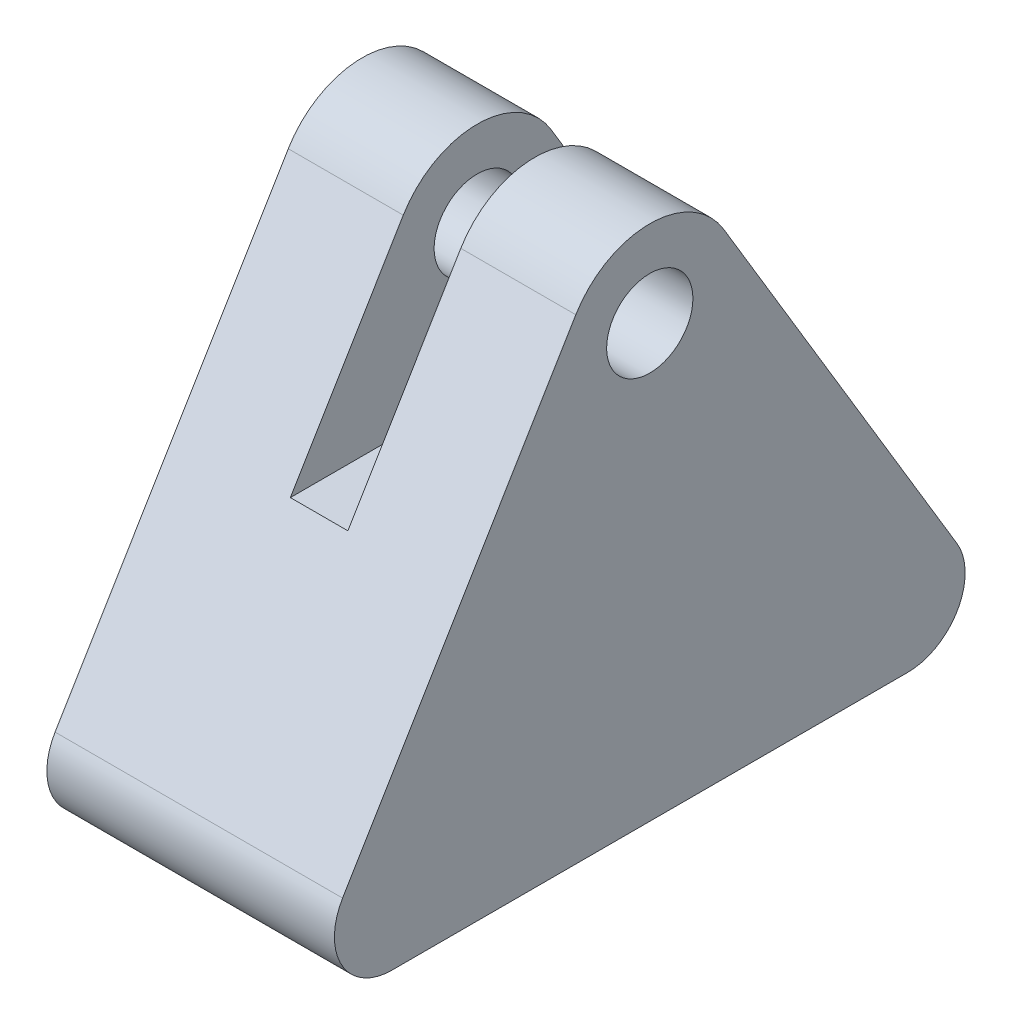
ISO-10303-21;
HEADER;
FILE_DESCRIPTION(('STEP AP214'),'2;1');
FILE_NAME('part.step','',(''),(''),'','','');
FILE_SCHEMA(('AUTOMOTIVE_DESIGN { 1 0 10303 214 1 1 1 1 }'));
ENDSEC;
DATA;
#1=APPLICATION_CONTEXT('core data for automotive mechanical design processes');
#2=APPLICATION_PROTOCOL_DEFINITION('international standard','automotive_design',2000,#1);
#3=PRODUCT_CONTEXT('',#1,'mechanical');
#4=PRODUCT('Part','Part','',(#3));
#5=PRODUCT_RELATED_PRODUCT_CATEGORY('part','',(#4));
#6=PRODUCT_DEFINITION_FORMATION('','',#4);
#7=PRODUCT_DEFINITION_CONTEXT('part definition',#1,'design');
#8=PRODUCT_DEFINITION('design','',#6,#7);
#9=PRODUCT_DEFINITION_SHAPE('','',#8);
#10=(LENGTH_UNIT() NAMED_UNIT(*) SI_UNIT(.MILLI.,.METRE.));
#11=(NAMED_UNIT(*) PLANE_ANGLE_UNIT() SI_UNIT($,.RADIAN.));
#12=(NAMED_UNIT(*) SI_UNIT($,.STERADIAN.) SOLID_ANGLE_UNIT());
#13=UNCERTAINTY_MEASURE_WITH_UNIT(LENGTH_MEASURE(1.E-05),#10,'distance_accuracy_value','');
#14=(GEOMETRIC_REPRESENTATION_CONTEXT(3) GLOBAL_UNCERTAINTY_ASSIGNED_CONTEXT((#13)) GLOBAL_UNIT_ASSIGNED_CONTEXT((#10,
#11,#12)) REPRESENTATION_CONTEXT('',''));
#15=CARTESIAN_POINT('',(0.,0.,0.));
#16=DIRECTION('',(0.,0.,1.));
#17=DIRECTION('',(1.,0.,0.));
#18=AXIS2_PLACEMENT_3D('',#15,#16,#17);
#19=CARTESIAN_POINT('',(5.,0.,0.));
#20=DIRECTION('',(-1.,0.,0.));
#21=DIRECTION('',(0.,0.,1.));
#22=AXIS2_PLACEMENT_3D('',#19,#20,#21);
#23=CYLINDRICAL_SURFACE('',#22,3.);
#24=CARTESIAN_POINT('',(-1.,0.,0.));
#25=DIRECTION('',(-1.,0.,0.));
#26=DIRECTION('',(0.,-1.,0.));
#27=AXIS2_PLACEMENT_3D('',#24,#25,#26);
#28=CIRCLE('',#27,3.);
#29=CARTESIAN_POINT('',(-1.,1.54365062769588,2.57238075323505));
#30=VERTEX_POINT('',#29);
#31=CARTESIAN_POINT('',(-1.,1.54365062769588,-2.57238075323505));
#32=VERTEX_POINT('',#31);
#33=EDGE_CURVE('E148',#30,#32,#28,.T.);
#34=ORIENTED_EDGE('',*,*,#33,.T.);
#35=DIRECTION('',(-1.,0.,0.));
#36=VECTOR('',#35,1.);
#37=CARTESIAN_POINT('',(5.,1.54365062769588,-2.57238075323505));
#38=LINE('',#37,#36);
#39=CARTESIAN_POINT('',(-5.,1.54365062769588,-2.57238075323505));
#40=VERTEX_POINT('',#39);
#41=EDGE_CURVE('E167',#32,#40,#38,.T.);
#42=ORIENTED_EDGE('',*,*,#41,.T.);
#43=CARTESIAN_POINT('',(-5.,0.,0.));
#44=DIRECTION('',(1.,0.,0.));
#45=DIRECTION('',(0.,0.,-1.));
#46=AXIS2_PLACEMENT_3D('',#43,#44,#45);
#47=CIRCLE('',#46,3.);
#48=CARTESIAN_POINT('',(-5.,1.54365062769588,2.57238075323505));
#49=VERTEX_POINT('',#48);
#50=EDGE_CURVE('E154',#40,#49,#47,.T.);
#51=ORIENTED_EDGE('',*,*,#50,.T.);
#52=DIRECTION('',(-1.,0.,0.));
#53=VECTOR('',#52,1.);
#54=CARTESIAN_POINT('',(5.,1.54365062769588,2.57238075323505));
#55=LINE('',#54,#53);
#56=EDGE_CURVE('E178',#30,#49,#55,.T.);
#57=ORIENTED_EDGE('',*,*,#56,.F.);
#58=EDGE_LOOP('',(#34,#42,#51,#57));
#59=FACE_BOUND('',#58,.T.);
#60=ADVANCED_FACE('F34',(#59),#23,.T.);
#61=CARTESIAN_POINT('',(5.,0.,0.));
#62=DIRECTION('',(-1.,0.,0.));
#63=DIRECTION('',(0.,0.,1.));
#64=AXIS2_PLACEMENT_3D('',#61,#62,#63);
#65=CYLINDRICAL_SURFACE('',#64,1.5);
#66=CARTESIAN_POINT('',(-1.,0.,0.));
#67=DIRECTION('',(-1.,0.,0.));
#68=DIRECTION('',(0.,-1.,0.));
#69=AXIS2_PLACEMENT_3D('',#66,#67,#68);
#70=CIRCLE('',#69,1.5);
#71=CARTESIAN_POINT('',(-1.,-1.5,0.));
#72=VERTEX_POINT('',#71);
#73=EDGE_CURVE('E137',#72,#72,#70,.T.);
#74=ORIENTED_EDGE('',*,*,#73,.F.);
#75=EDGE_LOOP('',(#74));
#76=FACE_BOUND('',#75,.T.);
#77=CARTESIAN_POINT('',(-5.,0.,0.));
#78=DIRECTION('',(1.,0.,0.));
#79=DIRECTION('',(0.,0.,-1.));
#80=AXIS2_PLACEMENT_3D('',#77,#78,#79);
#81=CIRCLE('',#80,1.5);
#82=CARTESIAN_POINT('',(-5.,0.,-1.5));
#83=VERTEX_POINT('',#82);
#84=EDGE_CURVE('E121',#83,#83,#81,.T.);
#85=ORIENTED_EDGE('',*,*,#84,.F.);
#86=EDGE_LOOP('',(#85));
#87=FACE_BOUND('',#86,.T.);
#88=ADVANCED_FACE('F238',(#76,#87),#65,.F.);
#89=CARTESIAN_POINT('',(5.,0.,0.));
#90=DIRECTION('',(1.,0.,0.));
#91=DIRECTION('',(0.,0.,-1.));
#92=AXIS2_PLACEMENT_3D('',#89,#90,#91);
#93=PLANE('',#92);
#94=DIRECTION('',(0.,0.,-1.));
#95=VECTOR('',#94,1.);
#96=CARTESIAN_POINT('',(5.,-15.,-12.5));
#97=LINE('',#96,#95);
#98=CARTESIAN_POINT('',(5.,-15.,8.96735762426948));
#99=VERTEX_POINT('',#98);
#100=CARTESIAN_POINT('',(5.,-15.,-8.96735762426948));
#101=VERTEX_POINT('',#100);
#102=EDGE_CURVE('E163',#99,#101,#97,.T.);
#103=ORIENTED_EDGE('',*,*,#102,.T.);
#104=CARTESIAN_POINT('',(5.,-13.,-8.96735762426948));
#105=DIRECTION('',(1.,0.,0.));
#106=DIRECTION('',(0.,0.,-1.));
#107=AXIS2_PLACEMENT_3D('',#104,#105,#106);
#108=CIRCLE('',#107,2.);
#109=CARTESIAN_POINT('',(5.,-11.9708995815361,-10.6822781264262));
#110=VERTEX_POINT('',#109);
#111=EDGE_CURVE('E42',#101,#110,#108,.T.);
#112=ORIENTED_EDGE('',*,*,#111,.T.);
#113=DIRECTION('',(0.,0.85746025107835,0.514550209231959));
#114=VECTOR('',#113,1.);
#115=CARTESIAN_POINT('',(5.,1.54365062769588,-2.57238075323505));
#116=LINE('',#115,#114);
#117=CARTESIAN_POINT('',(5.,1.54365062769588,-2.57238075323505));
#118=VERTEX_POINT('',#117);
#119=EDGE_CURVE('E165',#110,#118,#116,.T.);
#120=ORIENTED_EDGE('',*,*,#119,.T.);
#121=CARTESIAN_POINT('',(5.,0.,0.));
#122=DIRECTION('',(1.,0.,0.));
#123=DIRECTION('',(0.,0.,-1.));
#124=AXIS2_PLACEMENT_3D('',#121,#122,#123);
#125=CIRCLE('',#124,3.);
#126=CARTESIAN_POINT('',(5.,1.54365062769588,2.57238075323505));
#127=VERTEX_POINT('',#126);
#128=EDGE_CURVE('E157',#118,#127,#125,.T.);
#129=ORIENTED_EDGE('',*,*,#128,.T.);
#130=DIRECTION('',(0.,-0.85746025107835,0.514550209231959));
#131=VECTOR('',#130,1.);
#132=CARTESIAN_POINT('',(5.,-15.,12.5));
#133=LINE('',#132,#131);
#134=CARTESIAN_POINT('',(5.,-11.9708995815361,10.6822781264262));
#135=VERTEX_POINT('',#134);
#136=EDGE_CURVE('E160',#127,#135,#133,.T.);
#137=ORIENTED_EDGE('',*,*,#136,.T.);
#138=CARTESIAN_POINT('',(5.,-13.,8.96735762426948));
#139=DIRECTION('',(1.,0.,0.));
#140=DIRECTION('',(0.,0.,-1.));
#141=AXIS2_PLACEMENT_3D('',#138,#139,#140);
#142=CIRCLE('',#141,2.);
#143=EDGE_CURVE('E195',#135,#99,#142,.T.);
#144=ORIENTED_EDGE('',*,*,#143,.T.);
#145=EDGE_LOOP('',(#103,#112,#120,#129,#137,#144));
#146=FACE_BOUND('',#145,.T.);
#147=CARTESIAN_POINT('',(5.,0.,0.));
#148=DIRECTION('',(1.,0.,0.));
#149=DIRECTION('',(0.,0.,-1.));
#150=AXIS2_PLACEMENT_3D('',#147,#148,#149);
#151=CIRCLE('',#150,1.5);
#152=CARTESIAN_POINT('',(5.,0.,-1.5));
#153=VERTEX_POINT('',#152);
#154=EDGE_CURVE('E151',#153,#153,#151,.T.);
#155=ORIENTED_EDGE('',*,*,#154,.F.);
#156=EDGE_LOOP('',(#155));
#157=FACE_BOUND('',#156,.T.);
#158=ADVANCED_FACE('F199',(#146,#157),#93,.T.);
#159=CARTESIAN_POINT('',(-5.,0.,0.));
#160=DIRECTION('',(1.,0.,0.));
#161=DIRECTION('',(0.,0.,-1.));
#162=AXIS2_PLACEMENT_3D('',#159,#160,#161);
#163=PLANE('',#162);
#164=DIRECTION('',(0.,0.85746025107835,0.514550209231959));
#165=VECTOR('',#164,1.);
#166=CARTESIAN_POINT('',(-5.,1.54365062769588,-2.57238075323505));
#167=LINE('',#166,#165);
#168=CARTESIAN_POINT('',(-5.,-11.9708995815361,-10.6822781264262));
#169=VERTEX_POINT('',#168);
#170=EDGE_CURVE('E161',#169,#40,#167,.T.);
#171=ORIENTED_EDGE('',*,*,#170,.F.);
#172=CARTESIAN_POINT('',(-5.,-13.,-8.96735762426948));
#173=DIRECTION('',(1.,0.,0.));
#174=DIRECTION('',(0.,0.,-1.));
#175=AXIS2_PLACEMENT_3D('',#172,#173,#174);
#176=CIRCLE('',#175,2.);
#177=CARTESIAN_POINT('',(-5.,-15.,-8.96735762426948));
#178=VERTEX_POINT('',#177);
#179=EDGE_CURVE('E189',#169,#178,#176,.F.);
#180=ORIENTED_EDGE('',*,*,#179,.T.);
#181=DIRECTION('',(0.,0.,-1.));
#182=VECTOR('',#181,1.);
#183=CARTESIAN_POINT('',(-5.,-15.,-12.5));
#184=LINE('',#183,#182);
#185=CARTESIAN_POINT('',(-5.,-15.,8.96735762426948));
#186=VERTEX_POINT('',#185);
#187=EDGE_CURVE('E172',#186,#178,#184,.T.);
#188=ORIENTED_EDGE('',*,*,#187,.F.);
#189=CARTESIAN_POINT('',(-5.,-13.,8.96735762426948));
#190=DIRECTION('',(1.,0.,0.));
#191=DIRECTION('',(0.,0.,-1.));
#192=AXIS2_PLACEMENT_3D('',#189,#190,#191);
#193=CIRCLE('',#192,2.);
#194=CARTESIAN_POINT('',(-5.,-11.9708995815361,10.6822781264262));
#195=VERTEX_POINT('',#194);
#196=EDGE_CURVE('E187',#186,#195,#193,.F.);
#197=ORIENTED_EDGE('',*,*,#196,.T.);
#198=DIRECTION('',(0.,-0.85746025107835,0.514550209231959));
#199=VECTOR('',#198,1.);
#200=CARTESIAN_POINT('',(-5.,-15.,12.5));
#201=LINE('',#200,#199);
#202=EDGE_CURVE('E170',#49,#195,#201,.T.);
#203=ORIENTED_EDGE('',*,*,#202,.F.);
#204=ORIENTED_EDGE('',*,*,#50,.F.);
#205=EDGE_LOOP('',(#171,#180,#188,#197,#203,#204));
#206=FACE_BOUND('',#205,.T.);
#207=ORIENTED_EDGE('',*,*,#84,.T.);
#208=EDGE_LOOP('',(#207));
#209=FACE_BOUND('',#208,.T.);
#210=ADVANCED_FACE('F211',(#206,#209),#163,.F.);
#211=CARTESIAN_POINT('',(1.,1.54365062769588,-2.57238075323505));
#212=VERTEX_POINT('',#211);
#213=EDGE_CURVE('E175',#118,#212,#38,.T.);
#214=ORIENTED_EDGE('',*,*,#213,.T.);
#215=CARTESIAN_POINT('',(1.,0.,0.));
#216=DIRECTION('',(1.,0.,0.));
#217=DIRECTION('',(0.,1.,0.));
#218=AXIS2_PLACEMENT_3D('',#215,#216,#217);
#219=CIRCLE('',#218,3.);
#220=CARTESIAN_POINT('',(1.,1.54365062769588,2.57238075323505));
#221=VERTEX_POINT('',#220);
#222=EDGE_CURVE('E138',#212,#221,#219,.T.);
#223=ORIENTED_EDGE('',*,*,#222,.T.);
#224=EDGE_CURVE('E136',#127,#221,#55,.T.);
#225=ORIENTED_EDGE('',*,*,#224,.F.);
#226=ORIENTED_EDGE('',*,*,#128,.F.);
#227=EDGE_LOOP('',(#214,#223,#225,#226));
#228=FACE_BOUND('',#227,.T.);
#229=ADVANCED_FACE('F228',(#228),#23,.T.);
#230=CARTESIAN_POINT('',(5.,-15.,12.5));
#231=DIRECTION('',(0.,-0.514550209231959,-0.85746025107835));
#232=DIRECTION('',(0.,0.85746025107835,-0.514550209231959));
#233=AXIS2_PLACEMENT_3D('',#230,#231,#232);
#234=PLANE('',#233);
#235=ORIENTED_EDGE('',*,*,#202,.T.);
#236=DIRECTION('',(-1.,0.,0.));
#237=VECTOR('',#236,1.);
#238=CARTESIAN_POINT('',(5.,-11.9708995815361,10.6822781264262));
#239=LINE('',#238,#237);
#240=EDGE_CURVE('E11',#195,#135,#239,.F.);
#241=ORIENTED_EDGE('',*,*,#240,.T.);
#242=ORIENTED_EDGE('',*,*,#136,.F.);
#243=ORIENTED_EDGE('',*,*,#224,.T.);
#244=DIRECTION('',(0.,-0.85746025107835,0.514550209231959));
#245=VECTOR('',#244,1.);
#246=CARTESIAN_POINT('',(0.999999999999997,-15.,12.5));
#247=LINE('',#246,#245);
#248=CARTESIAN_POINT('',(0.999999999999999,-5.,6.49913630299649));
#249=VERTEX_POINT('',#248);
#250=EDGE_CURVE('E126',#221,#249,#247,.T.);
#251=ORIENTED_EDGE('',*,*,#250,.T.);
#252=DIRECTION('',(-1.,0.,0.));
#253=VECTOR('',#252,1.);
#254=CARTESIAN_POINT('',(5.,-5.,6.49913630299649));
#255=LINE('',#254,#253);
#256=CARTESIAN_POINT('',(-0.999999999999999,-5.,6.49913630299649));
#257=VERTEX_POINT('',#256);
#258=EDGE_CURVE('E112',#249,#257,#255,.T.);
#259=ORIENTED_EDGE('',*,*,#258,.T.);
#260=DIRECTION('',(0.,0.85746025107835,-0.514550209231959));
#261=VECTOR('',#260,1.);
#262=CARTESIAN_POINT('',(-0.999999999999997,-15.,12.5));
#263=LINE('',#262,#261);
#264=EDGE_CURVE('E122',#257,#30,#263,.T.);
#265=ORIENTED_EDGE('',*,*,#264,.T.);
#266=ORIENTED_EDGE('',*,*,#56,.T.);
#267=EDGE_LOOP('',(#235,#241,#242,#243,#251,#259,#265,#266));
#268=FACE_BOUND('',#267,.T.);
#269=ADVANCED_FACE('F134',(#268),#234,.F.);
#270=CARTESIAN_POINT('',(5.,-15.,-12.5));
#271=DIRECTION('',(0.,1.,0.));
#272=DIRECTION('',(0.,0.,1.));
#273=AXIS2_PLACEMENT_3D('',#270,#271,#272);
#274=PLANE('',#273);
#275=ORIENTED_EDGE('',*,*,#187,.T.);
#276=DIRECTION('',(-1.,0.,0.));
#277=VECTOR('',#276,1.);
#278=CARTESIAN_POINT('',(5.,-15.,-8.96735762426948));
#279=LINE('',#278,#277);
#280=EDGE_CURVE('E55',#178,#101,#279,.F.);
#281=ORIENTED_EDGE('',*,*,#280,.T.);
#282=ORIENTED_EDGE('',*,*,#102,.F.);
#283=DIRECTION('',(-1.,0.,0.));
#284=VECTOR('',#283,1.);
#285=CARTESIAN_POINT('',(5.,-15.,8.96735762426948));
#286=LINE('',#285,#284);
#287=EDGE_CURVE('E191',#99,#186,#286,.T.);
#288=ORIENTED_EDGE('',*,*,#287,.T.);
#289=EDGE_LOOP('',(#275,#281,#282,#288));
#290=FACE_BOUND('',#289,.T.);
#291=ADVANCED_FACE('F214',(#290),#274,.F.);
#292=CARTESIAN_POINT('',(5.,1.54365062769588,-2.57238075323505));
#293=DIRECTION('',(0.,-0.514550209231959,0.85746025107835));
#294=DIRECTION('',(0.,-0.85746025107835,-0.514550209231959));
#295=AXIS2_PLACEMENT_3D('',#292,#293,#294);
#296=PLANE('',#295);
#297=ORIENTED_EDGE('',*,*,#119,.F.);
#298=DIRECTION('',(-1.,0.,0.));
#299=VECTOR('',#298,1.);
#300=CARTESIAN_POINT('',(5.,-11.9708995815361,-10.6822781264262));
#301=LINE('',#300,#299);
#302=EDGE_CURVE('E184',#110,#169,#301,.T.);
#303=ORIENTED_EDGE('',*,*,#302,.T.);
#304=ORIENTED_EDGE('',*,*,#170,.T.);
#305=ORIENTED_EDGE('',*,*,#41,.F.);
#306=DIRECTION('',(0.,-0.85746025107835,-0.514550209231959));
#307=VECTOR('',#306,1.);
#308=CARTESIAN_POINT('',(-1.,1.54365062769588,-2.57238075323505));
#309=LINE('',#308,#307);
#310=CARTESIAN_POINT('',(-0.999999999999999,-5.,-6.49913630299649));
#311=VERTEX_POINT('',#310);
#312=EDGE_CURVE('E141',#32,#311,#309,.T.);
#313=ORIENTED_EDGE('',*,*,#312,.T.);
#314=DIRECTION('',(1.,0.,0.));
#315=VECTOR('',#314,1.);
#316=CARTESIAN_POINT('',(5.,-5.,-6.49913630299649));
#317=LINE('',#316,#315);
#318=CARTESIAN_POINT('',(0.999999999999999,-5.,-6.49913630299649));
#319=VERTEX_POINT('',#318);
#320=EDGE_CURVE('E180',#311,#319,#317,.T.);
#321=ORIENTED_EDGE('',*,*,#320,.T.);
#322=DIRECTION('',(0.,0.85746025107835,0.514550209231959));
#323=VECTOR('',#322,1.);
#324=CARTESIAN_POINT('',(1.,1.54365062769588,-2.57238075323505));
#325=LINE('',#324,#323);
#326=EDGE_CURVE('E129',#319,#212,#325,.T.);
#327=ORIENTED_EDGE('',*,*,#326,.T.);
#328=ORIENTED_EDGE('',*,*,#213,.F.);
#329=EDGE_LOOP('',(#297,#303,#304,#305,#313,#321,#327,#328));
#330=FACE_BOUND('',#329,.T.);
#331=ADVANCED_FACE('F205',(#330),#296,.F.);
#332=CARTESIAN_POINT('',(1.,0.,0.));
#333=DIRECTION('',(1.,0.,0.));
#334=DIRECTION('',(0.,1.,0.));
#335=AXIS2_PLACEMENT_3D('',#332,#333,#334);
#336=CIRCLE('',#335,1.5);
#337=CARTESIAN_POINT('',(1.,1.5,0.));
#338=VERTEX_POINT('',#337);
#339=EDGE_CURVE('E131',#338,#338,#336,.T.);
#340=ORIENTED_EDGE('',*,*,#339,.F.);
#341=EDGE_LOOP('',(#340));
#342=FACE_BOUND('',#341,.T.);
#343=ORIENTED_EDGE('',*,*,#154,.T.);
#344=EDGE_LOOP('',(#343));
#345=FACE_BOUND('',#344,.T.);
#346=ADVANCED_FACE('F244',(#342,#345),#65,.F.);
#347=CARTESIAN_POINT('',(-0.999999999999999,-5.,-12.5));
#348=DIRECTION('',(0.,-1.,0.));
#349=DIRECTION('',(0.,0.,-1.));
#350=AXIS2_PLACEMENT_3D('',#347,#348,#349);
#351=PLANE('',#350);
#352=DIRECTION('',(0.,0.,1.));
#353=VECTOR('',#352,1.);
#354=CARTESIAN_POINT('',(0.999999999999999,-5.,-12.5));
#355=LINE('',#354,#353);
#356=EDGE_CURVE('E115',#319,#249,#355,.T.);
#357=ORIENTED_EDGE('',*,*,#356,.F.);
#358=ORIENTED_EDGE('',*,*,#320,.F.);
#359=DIRECTION('',(0.,0.,1.));
#360=VECTOR('',#359,1.);
#361=CARTESIAN_POINT('',(-0.999999999999999,-5.,-12.5));
#362=LINE('',#361,#360);
#363=EDGE_CURVE('E118',#311,#257,#362,.T.);
#364=ORIENTED_EDGE('',*,*,#363,.T.);
#365=ORIENTED_EDGE('',*,*,#258,.F.);
#366=EDGE_LOOP('',(#357,#358,#364,#365));
#367=FACE_BOUND('',#366,.T.);
#368=ADVANCED_FACE('F114',(#367),#351,.F.);
#369=CARTESIAN_POINT('',(-1.,3.,-12.5));
#370=DIRECTION('',(-1.,0.,0.));
#371=DIRECTION('',(0.,-1.,0.));
#372=AXIS2_PLACEMENT_3D('',#369,#370,#371);
#373=PLANE('',#372);
#374=ORIENTED_EDGE('',*,*,#73,.T.);
#375=EDGE_LOOP('',(#374));
#376=FACE_BOUND('',#375,.T.);
#377=ORIENTED_EDGE('',*,*,#363,.F.);
#378=ORIENTED_EDGE('',*,*,#312,.F.);
#379=ORIENTED_EDGE('',*,*,#33,.F.);
#380=ORIENTED_EDGE('',*,*,#264,.F.);
#381=EDGE_LOOP('',(#377,#378,#379,#380));
#382=FACE_BOUND('',#381,.T.);
#383=ADVANCED_FACE('F225',(#376,#382),#373,.F.);
#384=CARTESIAN_POINT('',(1.,3.,-12.5));
#385=DIRECTION('',(1.,0.,0.));
#386=DIRECTION('',(0.,1.,0.));
#387=AXIS2_PLACEMENT_3D('',#384,#385,#386);
#388=PLANE('',#387);
#389=ORIENTED_EDGE('',*,*,#339,.T.);
#390=EDGE_LOOP('',(#389));
#391=FACE_BOUND('',#390,.T.);
#392=ORIENTED_EDGE('',*,*,#222,.F.);
#393=ORIENTED_EDGE('',*,*,#326,.F.);
#394=ORIENTED_EDGE('',*,*,#356,.T.);
#395=ORIENTED_EDGE('',*,*,#250,.F.);
#396=EDGE_LOOP('',(#392,#393,#394,#395));
#397=FACE_BOUND('',#396,.T.);
#398=ADVANCED_FACE('F125',(#391,#397),#388,.F.);
#399=CARTESIAN_POINT('',(5.,-13.,-8.96735762426948));
#400=DIRECTION('',(-1.,0.,0.));
#401=DIRECTION('',(0.,0.,1.));
#402=AXIS2_PLACEMENT_3D('',#399,#400,#401);
#403=CYLINDRICAL_SURFACE('',#402,2.);
#404=ORIENTED_EDGE('',*,*,#111,.F.);
#405=ORIENTED_EDGE('',*,*,#280,.F.);
#406=ORIENTED_EDGE('',*,*,#179,.F.);
#407=ORIENTED_EDGE('',*,*,#302,.F.);
#408=EDGE_LOOP('',(#404,#405,#406,#407));
#409=FACE_BOUND('',#408,.T.);
#410=ADVANCED_FACE('F208',(#409),#403,.T.);
#411=CARTESIAN_POINT('',(5.,-13.,8.96735762426948));
#412=DIRECTION('',(-1.,0.,0.));
#413=DIRECTION('',(0.,0.,1.));
#414=AXIS2_PLACEMENT_3D('',#411,#412,#413);
#415=CYLINDRICAL_SURFACE('',#414,2.);
#416=ORIENTED_EDGE('',*,*,#143,.F.);
#417=ORIENTED_EDGE('',*,*,#240,.F.);
#418=ORIENTED_EDGE('',*,*,#196,.F.);
#419=ORIENTED_EDGE('',*,*,#287,.F.);
#420=EDGE_LOOP('',(#416,#417,#418,#419));
#421=FACE_BOUND('',#420,.T.);
#422=ADVANCED_FACE('F36',(#421),#415,.T.);
#423=CLOSED_SHELL('',(#60,#88,#158,#210,#229,#269,#291,#331,#346,#368,#383,#398,#410,#422));
#424=MANIFOLD_SOLID_BREP('B2',#423);
#425=ADVANCED_BREP_SHAPE_REPRESENTATION('',(#18,#424),#14);
#426=SHAPE_DEFINITION_REPRESENTATION(#9,#425);
ENDSEC;
END-ISO-10303-21;
